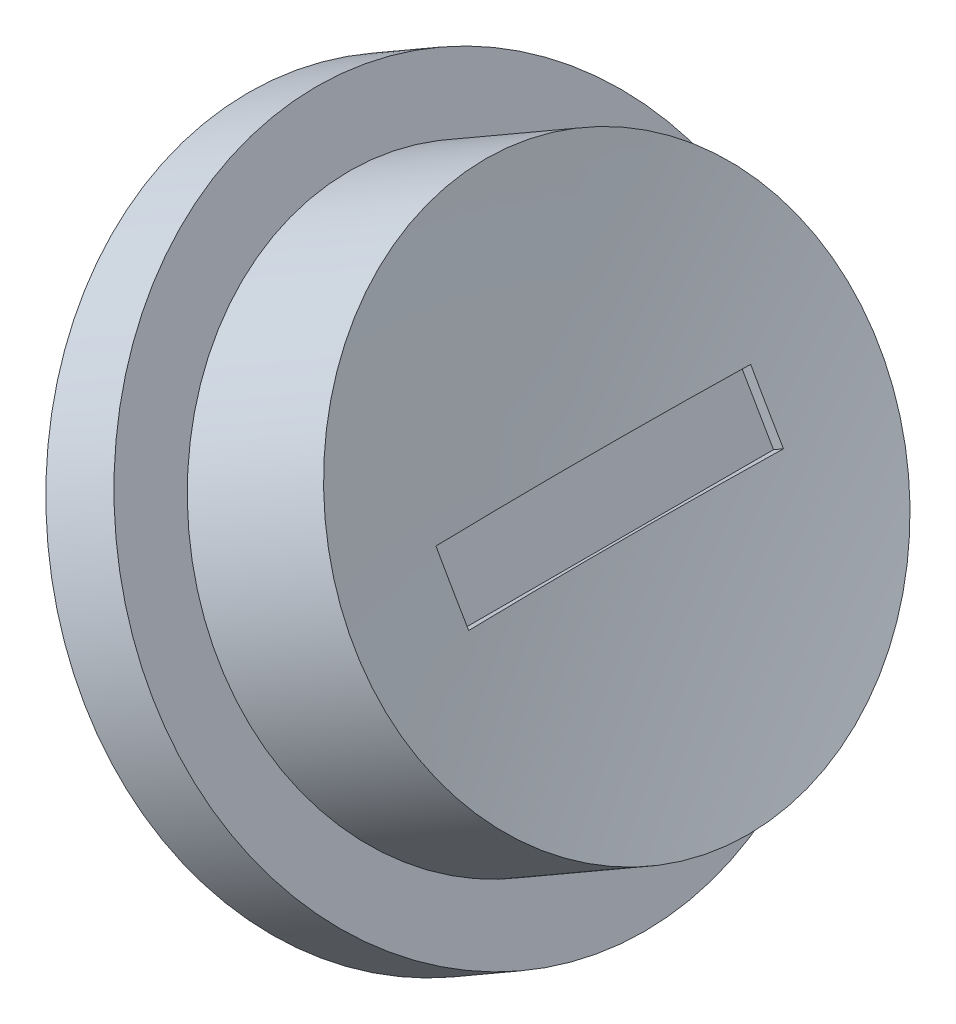
ISO-10303-21;
HEADER;
FILE_DESCRIPTION(('STEP AP214'),'2;1');
FILE_NAME('part.step','',(''),(''),'','','');
FILE_SCHEMA(('AUTOMOTIVE_DESIGN { 1 0 10303 214 1 1 1 1 }'));
ENDSEC;
DATA;
#1=APPLICATION_CONTEXT('core data for automotive mechanical design processes');
#2=APPLICATION_PROTOCOL_DEFINITION('international standard','automotive_design',2000,#1);
#3=PRODUCT_CONTEXT('',#1,'mechanical');
#4=PRODUCT('Part','Part','',(#3));
#5=PRODUCT_RELATED_PRODUCT_CATEGORY('part','',(#4));
#6=PRODUCT_DEFINITION_FORMATION('','',#4);
#7=PRODUCT_DEFINITION_CONTEXT('part definition',#1,'design');
#8=PRODUCT_DEFINITION('design','',#6,#7);
#9=PRODUCT_DEFINITION_SHAPE('','',#8);
#10=(LENGTH_UNIT() NAMED_UNIT(*) SI_UNIT(.MILLI.,.METRE.));
#11=(NAMED_UNIT(*) PLANE_ANGLE_UNIT() SI_UNIT($,.RADIAN.));
#12=(NAMED_UNIT(*) SI_UNIT($,.STERADIAN.) SOLID_ANGLE_UNIT());
#13=UNCERTAINTY_MEASURE_WITH_UNIT(LENGTH_MEASURE(1.E-05),#10,'distance_accuracy_value','');
#14=(GEOMETRIC_REPRESENTATION_CONTEXT(3) GLOBAL_UNCERTAINTY_ASSIGNED_CONTEXT((#13)) GLOBAL_UNIT_ASSIGNED_CONTEXT((#10,
#11,#12)) REPRESENTATION_CONTEXT('',''));
#15=CARTESIAN_POINT('',(0.,0.,0.));
#16=DIRECTION('',(0.,0.,1.));
#17=DIRECTION('',(1.,0.,0.));
#18=AXIS2_PLACEMENT_3D('',#15,#16,#17);
#19=CARTESIAN_POINT('',(60.5272413359522,-85.8362572358523,0.));
#20=DIRECTION('',(-0.866025403784438,-0.500000000000001,0.));
#21=DIRECTION('',(0.500000000000001,-0.866025403784438,0.));
#22=AXIS2_PLACEMENT_3D('',#19,#20,#21);
#23=PLANE('',#22);
#24=CARTESIAN_POINT('',(60.5272413359522,-85.8362572358523,0.));
#25=DIRECTION('',(0.866025403784438,0.500000000000001,0.));
#26=DIRECTION('',(-0.500000000000001,0.866025403784438,0.));
#27=AXIS2_PLACEMENT_3D('',#24,#25,#26);
#28=CIRCLE('',#27,2.);
#29=CARTESIAN_POINT('',(59.5272413359522,-84.1042064282834,0.));
#30=VERTEX_POINT('',#29);
#31=EDGE_CURVE('E123',#30,#30,#28,.T.);
#32=ORIENTED_EDGE('',*,*,#31,.F.);
#33=EDGE_LOOP('',(#32));
#34=FACE_BOUND('',#33,.T.);
#35=ADVANCED_FACE('F36',(#34),#23,.T.);
#36=CARTESIAN_POINT('',(65.7233937586588,-82.8362572358523,0.));
#37=DIRECTION('',(0.866025403784438,0.500000000000001,0.));
#38=DIRECTION('',(-0.500000000000001,0.866025403784438,0.));
#39=AXIS2_PLACEMENT_3D('',#36,#37,#38);
#40=CYLINDRICAL_SURFACE('',#39,2.);
#41=CARTESIAN_POINT('',(64.4243556529821,-83.5862572358523,0.));
#42=DIRECTION('',(0.866025403784438,0.500000000000001,0.));
#43=DIRECTION('',(-0.500000000000001,0.866025403784438,0.));
#44=AXIS2_PLACEMENT_3D('',#41,#42,#43);
#45=CIRCLE('',#44,1.99999999999999);
#46=CARTESIAN_POINT('',(63.4243556529821,-81.8542064282835,0.));
#47=VERTEX_POINT('',#46);
#48=EDGE_CURVE('E120',#47,#47,#45,.T.);
#49=CARTESIAN_POINT('',(59.5272413359522,-84.1042064282834,0.));
#50=CARTESIAN_POINT('',(59.5678362767546,-84.0807689282834,0.));
#51=CARTESIAN_POINT('',(59.608431217557,-84.0573314282834,0.));
#52=CARTESIAN_POINT('',(59.6896210991618,-84.0104564282834,0.));
#53=CARTESIAN_POINT('',(59.7302160399642,-83.9870189282834,0.));
#54=CARTESIAN_POINT('',(59.811405921569,-83.9401439282834,0.));
#55=CARTESIAN_POINT('',(59.8520008623714,-83.9167064282834,0.));
#56=CARTESIAN_POINT('',(59.9331907439762,-83.8698314282834,0.));
#57=CARTESIAN_POINT('',(59.9737856847786,-83.8463939282834,0.));
#58=CARTESIAN_POINT('',(60.0549755663833,-83.7995189282834,0.));
#59=CARTESIAN_POINT('',(60.0955705071857,-83.7760814282834,0.));
#60=CARTESIAN_POINT('',(60.1767603887905,-83.7292064282834,0.));
#61=CARTESIAN_POINT('',(60.2173553295929,-83.7057689282834,0.));
#62=CARTESIAN_POINT('',(60.2985452111977,-83.6588939282834,0.));
#63=CARTESIAN_POINT('',(60.3391401520001,-83.6354564282834,0.));
#64=CARTESIAN_POINT('',(60.4203300336049,-83.5885814282834,0.));
#65=CARTESIAN_POINT('',(60.4609249744073,-83.5651439282834,0.));
#66=CARTESIAN_POINT('',(60.5421148560121,-83.5182689282834,0.));
#67=CARTESIAN_POINT('',(60.5827097968145,-83.4948314282834,0.));
#68=CARTESIAN_POINT('',(60.6638996784193,-83.4479564282834,0.));
#69=CARTESIAN_POINT('',(60.7044946192217,-83.4245189282834,0.));
#70=CARTESIAN_POINT('',(60.7856845008265,-83.3776439282834,0.));
#71=CARTESIAN_POINT('',(60.8262794416288,-83.3542064282834,0.));
#72=CARTESIAN_POINT('',(60.9074693232336,-83.3073314282834,0.));
#73=CARTESIAN_POINT('',(60.948064264036,-83.2838939282834,0.));
#74=CARTESIAN_POINT('',(61.0292541456408,-83.2370189282834,0.));
#75=CARTESIAN_POINT('',(61.0698490864432,-83.2135814282834,0.));
#76=CARTESIAN_POINT('',(61.151038968048,-83.1667064282834,0.));
#77=CARTESIAN_POINT('',(61.1916339088504,-83.1432689282834,0.));
#78=CARTESIAN_POINT('',(61.2728237904552,-83.0963939282834,0.));
#79=CARTESIAN_POINT('',(61.3134187312576,-83.0729564282834,0.));
#80=CARTESIAN_POINT('',(61.3946086128624,-83.0260814282834,0.));
#81=CARTESIAN_POINT('',(61.4352035536648,-83.0026439282834,0.));
#82=CARTESIAN_POINT('',(61.5163934352696,-82.9557689282834,0.));
#83=CARTESIAN_POINT('',(61.556988376072,-82.9323314282834,0.));
#84=CARTESIAN_POINT('',(61.6381782576767,-82.8854564282834,0.));
#85=CARTESIAN_POINT('',(61.6787731984791,-82.8620189282834,0.));
#86=CARTESIAN_POINT('',(61.7599630800839,-82.8151439282834,0.));
#87=CARTESIAN_POINT('',(61.8005580208863,-82.7917064282834,0.));
#88=CARTESIAN_POINT('',(61.8817479024911,-82.7448314282834,0.));
#89=CARTESIAN_POINT('',(61.9223428432935,-82.7213939282834,0.));
#90=CARTESIAN_POINT('',(62.0035327248983,-82.6745189282834,0.));
#91=CARTESIAN_POINT('',(62.0441276657007,-82.6510814282834,0.));
#92=CARTESIAN_POINT('',(62.1253175473055,-82.6042064282834,0.));
#93=CARTESIAN_POINT('',(62.1659124881079,-82.5807689282834,0.));
#94=CARTESIAN_POINT('',(62.2471023697127,-82.5338939282834,0.));
#95=CARTESIAN_POINT('',(62.2876973105151,-82.5104564282834,0.));
#96=CARTESIAN_POINT('',(62.3688871921199,-82.4635814282834,0.));
#97=CARTESIAN_POINT('',(62.4094821329223,-82.4401439282835,0.));
#98=CARTESIAN_POINT('',(62.4906720145271,-82.3932689282835,0.));
#99=CARTESIAN_POINT('',(62.5312669553294,-82.3698314282835,0.));
#100=CARTESIAN_POINT('',(62.6124568369342,-82.3229564282834,0.));
#101=CARTESIAN_POINT('',(62.6530517777366,-82.2995189282834,0.));
#102=CARTESIAN_POINT('',(62.7342416593414,-82.2526439282834,0.));
#103=CARTESIAN_POINT('',(62.7748366001438,-82.2292064282834,0.));
#104=CARTESIAN_POINT('',(62.8560264817486,-82.1823314282834,0.));
#105=CARTESIAN_POINT('',(62.896621422551,-82.1588939282835,0.));
#106=CARTESIAN_POINT('',(62.9778113041558,-82.1120189282835,0.));
#107=CARTESIAN_POINT('',(63.0184062449582,-82.0885814282835,0.));
#108=CARTESIAN_POINT('',(63.099596126563,-82.0417064282835,0.));
#109=CARTESIAN_POINT('',(63.1401910673654,-82.0182689282835,0.));
#110=CARTESIAN_POINT('',(63.2213809489702,-81.9713939282834,0.));
#111=CARTESIAN_POINT('',(63.2619758897726,-81.9479564282834,0.));
#112=CARTESIAN_POINT('',(63.3431657713774,-81.9010814282834,0.));
#113=CARTESIAN_POINT('',(63.3837607121797,-81.8776439282835,0.));
#114=CARTESIAN_POINT('',(63.4243556529821,-81.8542064282835,0.));
#115=B_SPLINE_CURVE_WITH_KNOTS('',3,(#49,#50,#51,#52,#53,#54,#55,#56,#57,#58,#59,#60,#61,#62,
#63,#64,#65,#66,#67,#68,#69,#70,#71,#72,#73,#74,#75,#76,#77,#78,#79,#80,#81,#82,#83,#84,#85,#86,
#87,#88,#89,#90,#91,#92,#93,#94,#95,#96,#97,#98,#99,#100,#101,#102,#103,#104,#105,#106,#107,
#108,#109,#110,#111,#112,#113,#114),.UNSPECIFIED.,.F.,.F.,(4,2,2,2,2,2,2,2,2,2,2,2,2,2,2,2,2,2,
2,2,2,2,2,2,2,2,2,2,2,2,2,2,4),(0.,0.140624999999999,0.281249999999998,0.42187499999999,
0.562499999999988,0.703124999999993,0.843749999999992,0.984374999999984,1.12499999999998,
1.26562499999998,1.40624999999999,1.54687499999999,1.68749999999998,1.82812499999998,
1.96874999999998,2.10937499999998,2.24999999999997,2.39062499999997,2.53124999999997,
2.67187499999997,2.81249999999997,2.95312499999996,3.09374999999996,3.23437499999996,
3.37499999999996,3.51562499999996,3.65624999999996,3.79687499999996,3.93749999999995,
4.07812499999995,4.21874999999995,4.35937499999996,4.49999999999995),.UNSPECIFIED.);
#116=EDGE_CURVE('BSEAM153',#30,#47,#115,.T.);
#117=ORIENTED_EDGE('',*,*,#31,.T.);
#118=ORIENTED_EDGE('',*,*,#48,.F.);
#119=ORIENTED_EDGE('',*,*,#116,.T.);
#120=ORIENTED_EDGE('',*,*,#116,.F.);
#121=EDGE_LOOP('',(#117,#119,#118,#120));
#122=FACE_BOUND('',#121,.T.);
#123=ADVANCED_FACE('F153',(#122),#40,.T.);
#124=CARTESIAN_POINT('',(63.4243556529821,-81.8542064282835,0.));
#125=DIRECTION('',(-0.866025403784438,-0.500000000000001,0.));
#126=DIRECTION('',(0.500000000000001,-0.866025403784438,0.));
#127=AXIS2_PLACEMENT_3D('',#124,#125,#126);
#128=PLANE('',#127);
#129=ORIENTED_EDGE('',*,*,#48,.T.);
#130=EDGE_LOOP('',(#129));
#131=FACE_BOUND('',#130,.T.);
#132=CARTESIAN_POINT('',(64.4243556529821,-83.5862572358523,0.));
#133=DIRECTION('',(0.866025403784438,0.500000000000001,0.));
#134=DIRECTION('',(-0.500000000000001,0.866025403784438,0.));
#135=AXIS2_PLACEMENT_3D('',#132,#133,#134);
#136=CIRCLE('',#135,3.00000000000005);
#137=CARTESIAN_POINT('',(62.9243556529821,-80.988181024499,0.));
#138=VERTEX_POINT('',#137);
#139=EDGE_CURVE('E117',#138,#138,#136,.T.);
#140=ORIENTED_EDGE('',*,*,#139,.F.);
#141=EDGE_LOOP('',(#140));
#142=FACE_BOUND('',#141,.T.);
#143=ADVANCED_FACE('F158',(#131,#142),#128,.T.);
#144=CARTESIAN_POINT('',(65.7233937586588,-82.8362572358523,0.));
#145=DIRECTION('',(0.866025403784438,0.500000000000001,0.));
#146=DIRECTION('',(-0.500000000000001,0.866025403784438,0.));
#147=AXIS2_PLACEMENT_3D('',#144,#145,#146);
#148=CYLINDRICAL_SURFACE('',#147,3.00000000000006);
#149=CARTESIAN_POINT('',(62.6057023050348,-84.6362572358523,0.));
#150=DIRECTION('',(0.866025403784438,0.500000000000001,0.));
#151=DIRECTION('',(-0.500000000000001,0.866025403784438,0.));
#152=AXIS2_PLACEMENT_3D('',#149,#150,#151);
#153=CIRCLE('',#152,3.00000000000007);
#154=CARTESIAN_POINT('',(61.1057023050348,-82.038181024499,0.));
#155=VERTEX_POINT('',#154);
#156=EDGE_CURVE('E114',#155,#155,#153,.T.);
#157=CARTESIAN_POINT('',(62.9243556529821,-80.988181024499,0.));
#158=CARTESIAN_POINT('',(62.9054113472743,-80.999118524499,0.));
#159=CARTESIAN_POINT('',(62.8864670415665,-81.010056024499,0.));
#160=CARTESIAN_POINT('',(62.848578430151,-81.031931024499,0.));
#161=CARTESIAN_POINT('',(62.8296341244432,-81.042868524499,0.));
#162=CARTESIAN_POINT('',(62.7917455130276,-81.064743524499,0.));
#163=CARTESIAN_POINT('',(62.7728012073198,-81.0756810244989,0.));
#164=CARTESIAN_POINT('',(62.7349125959043,-81.097556024499,0.));
#165=CARTESIAN_POINT('',(62.7159682901965,-81.108493524499,0.));
#166=CARTESIAN_POINT('',(62.6780796787809,-81.130368524499,0.));
#167=CARTESIAN_POINT('',(62.6591353730731,-81.141306024499,0.));
#168=CARTESIAN_POINT('',(62.6212467616576,-81.163181024499,0.));
#169=CARTESIAN_POINT('',(62.6023024559498,-81.174118524499,0.));
#170=CARTESIAN_POINT('',(62.5644138445342,-81.195993524499,0.));
#171=CARTESIAN_POINT('',(62.5454695388264,-81.206931024499,0.));
#172=CARTESIAN_POINT('',(62.5075809274108,-81.228806024499,0.));
#173=CARTESIAN_POINT('',(62.4886366217031,-81.2397435244989,0.));
#174=CARTESIAN_POINT('',(62.4507480102875,-81.261618524499,0.));
#175=CARTESIAN_POINT('',(62.4318037045797,-81.272556024499,0.));
#176=CARTESIAN_POINT('',(62.3939150931641,-81.294431024499,0.));
#177=CARTESIAN_POINT('',(62.3749707874564,-81.305368524499,0.));
#178=CARTESIAN_POINT('',(62.3370821760408,-81.327243524499,0.));
#179=CARTESIAN_POINT('',(62.318137870333,-81.338181024499,0.));
#180=CARTESIAN_POINT('',(62.2802492589174,-81.360056024499,0.));
#181=CARTESIAN_POINT('',(62.2613049532097,-81.3709935244989,0.));
#182=CARTESIAN_POINT('',(62.2234163417941,-81.392868524499,0.));
#183=CARTESIAN_POINT('',(62.2044720360863,-81.4038060244989,0.));
#184=CARTESIAN_POINT('',(62.1665834246707,-81.425681024499,0.));
#185=CARTESIAN_POINT('',(62.1476391189629,-81.436618524499,0.));
#186=CARTESIAN_POINT('',(62.1097505075474,-81.458493524499,0.));
#187=CARTESIAN_POINT('',(62.0908062018396,-81.469431024499,0.));
#188=CARTESIAN_POINT('',(62.052917590424,-81.491306024499,0.));
#189=CARTESIAN_POINT('',(62.0339732847162,-81.502243524499,0.));
#190=CARTESIAN_POINT('',(61.9960846733007,-81.524118524499,0.));
#191=CARTESIAN_POINT('',(61.9771403675929,-81.535056024499,0.));
#192=CARTESIAN_POINT('',(61.9392517561773,-81.556931024499,0.));
#193=CARTESIAN_POINT('',(61.9203074504695,-81.567868524499,0.));
#194=CARTESIAN_POINT('',(61.882418839054,-81.589743524499,0.));
#195=CARTESIAN_POINT('',(61.8634745333462,-81.600681024499,0.));
#196=CARTESIAN_POINT('',(61.8255859219306,-81.622556024499,0.));
#197=CARTESIAN_POINT('',(61.8066416162228,-81.6334935244989,0.));
#198=CARTESIAN_POINT('',(61.7687530048073,-81.655368524499,0.));
#199=CARTESIAN_POINT('',(61.7498086990995,-81.666306024499,0.));
#200=CARTESIAN_POINT('',(61.7119200876839,-81.688181024499,0.));
#201=CARTESIAN_POINT('',(61.6929757819761,-81.699118524499,0.));
#202=CARTESIAN_POINT('',(61.6550871705605,-81.720993524499,0.));
#203=CARTESIAN_POINT('',(61.6361428648528,-81.7319310244989,0.));
#204=CARTESIAN_POINT('',(61.5982542534372,-81.753806024499,0.));
#205=CARTESIAN_POINT('',(61.5793099477294,-81.764743524499,0.));
#206=CARTESIAN_POINT('',(61.5414213363138,-81.786618524499,0.));
#207=CARTESIAN_POINT('',(61.5224770306061,-81.7975560244989,0.));
#208=CARTESIAN_POINT('',(61.4845884191905,-81.819431024499,0.));
#209=CARTESIAN_POINT('',(61.4656441134827,-81.830368524499,0.));
#210=CARTESIAN_POINT('',(61.4277555020671,-81.852243524499,0.));
#211=CARTESIAN_POINT('',(61.4088111963594,-81.863181024499,0.));
#212=CARTESIAN_POINT('',(61.3709225849438,-81.885056024499,0.));
#213=CARTESIAN_POINT('',(61.351978279236,-81.895993524499,0.));
#214=CARTESIAN_POINT('',(61.3140896678204,-81.917868524499,0.));
#215=CARTESIAN_POINT('',(61.2951453621126,-81.928806024499,0.));
#216=CARTESIAN_POINT('',(61.2572567506971,-81.950681024499,0.));
#217=CARTESIAN_POINT('',(61.2383124449893,-81.961618524499,0.));
#218=CARTESIAN_POINT('',(61.2004238335737,-81.983493524499,0.));
#219=CARTESIAN_POINT('',(61.1814795278659,-81.994431024499,0.));
#220=CARTESIAN_POINT('',(61.1435909164504,-82.016306024499,0.));
#221=CARTESIAN_POINT('',(61.1246466107426,-82.027243524499,0.));
#222=CARTESIAN_POINT('',(61.1057023050348,-82.038181024499,0.));
#223=B_SPLINE_CURVE_WITH_KNOTS('',3,(#157,#158,#159,#160,#161,#162,#163,#164,#165,#166,#167,
#168,#169,#170,#171,#172,#173,#174,#175,#176,#177,#178,#179,#180,#181,#182,#183,#184,#185,#186,
#187,#188,#189,#190,#191,#192,#193,#194,#195,#196,#197,#198,#199,#200,#201,#202,#203,#204,#205,
#206,#207,#208,#209,#210,#211,#212,#213,#214,#215,#216,#217,#218,#219,#220,#221,#222),
.UNSPECIFIED.,.F.,.F.,(4,2,2,2,2,2,2,2,2,2,2,2,2,2,2,2,2,2,2,2,2,2,2,2,2,2,2,2,2,2,2,2,4),(0.,
0.0656249999999985,0.131250000000004,0.196875000000002,0.262500000000008,0.328124999999994,
0.39375,0.459374999999998,0.524999999999991,0.590624999999996,0.656250000000002,
0.721874999999994,0.787499999999993,0.853124999999998,0.918749999999998,0.984374999999996,1.05,
1.11562499999999,1.18125,1.24687499999999,1.31249999999999,1.37812499999999,1.44374999999999,
1.50937499999999,1.57499999999999,1.64062499999999,1.70624999999999,1.77187499999999,
1.83749999999999,1.90312499999999,1.96874999999999,2.03437499999999,2.09999999999999),.UNSPECIFIED.);
#224=EDGE_CURVE('BSEAM165',#138,#155,#223,.T.);
#225=ORIENTED_EDGE('',*,*,#139,.T.);
#226=ORIENTED_EDGE('',*,*,#156,.F.);
#227=ORIENTED_EDGE('',*,*,#224,.T.);
#228=ORIENTED_EDGE('',*,*,#224,.F.);
#229=EDGE_LOOP('',(#225,#227,#226,#228));
#230=FACE_BOUND('',#229,.T.);
#231=ADVANCED_FACE('F165',(#230),#148,.F.);
#232=CARTESIAN_POINT('',(61.1057023050348,-82.0381810244989,0.));
#233=DIRECTION('',(-0.866025403784438,-0.500000000000001,0.));
#234=DIRECTION('',(0.500000000000001,-0.866025403784438,0.));
#235=AXIS2_PLACEMENT_3D('',#232,#233,#234);
#236=PLANE('',#235);
#237=ORIENTED_EDGE('',*,*,#156,.T.);
#238=EDGE_LOOP('',(#237));
#239=FACE_BOUND('',#238,.T.);
#240=CARTESIAN_POINT('',(62.6057023050348,-84.6362572358523,0.));
#241=DIRECTION('',(0.866025403784438,0.500000000000001,0.));
#242=DIRECTION('',(-0.500000000000001,0.866025403784438,0.));
#243=AXIS2_PLACEMENT_3D('',#240,#241,#242);
#244=CIRCLE('',#243,5.00000000000007);
#245=CARTESIAN_POINT('',(60.1057023050348,-80.3061302169301,0.));
#246=VERTEX_POINT('',#245);
#247=EDGE_CURVE('E111',#246,#246,#244,.T.);
#248=ORIENTED_EDGE('',*,*,#247,.F.);
#249=EDGE_LOOP('',(#248));
#250=FACE_BOUND('',#249,.T.);
#251=ADVANCED_FACE('F169',(#239,#250),#236,.T.);
#252=CARTESIAN_POINT('',(65.7233937586588,-82.8362572358523,0.));
#253=DIRECTION('',(0.866025403784438,0.500000000000001,0.));
#254=DIRECTION('',(-0.500000000000001,0.866025403784438,0.));
#255=AXIS2_PLACEMENT_3D('',#252,#253,#254);
#256=CYLINDRICAL_SURFACE('',#255,5.00000000000007);
#257=CARTESIAN_POINT('',(63.6449327895762,-84.0362572358523,0.));
#258=DIRECTION('',(0.866025403784438,0.500000000000001,0.));
#259=DIRECTION('',(-0.500000000000001,0.866025403784438,0.));
#260=AXIS2_PLACEMENT_3D('',#257,#258,#259);
#261=CIRCLE('',#260,5.00000000000007);
#262=CARTESIAN_POINT('',(61.1449327895761,-79.7061302169301,0.));
#263=VERTEX_POINT('',#262);
#264=EDGE_CURVE('E108',#263,#263,#261,.T.);
#265=CARTESIAN_POINT('',(60.1057023050348,-80.3061302169301,0.));
#266=CARTESIAN_POINT('',(60.1165276225821,-80.2998802169301,0.));
#267=CARTESIAN_POINT('',(60.1273529401294,-80.2936302169301,0.));
#268=CARTESIAN_POINT('',(60.149003575224,-80.2811302169301,0.));
#269=CARTESIAN_POINT('',(60.1598288927713,-80.2748802169301,0.));
#270=CARTESIAN_POINT('',(60.1814795278659,-80.2623802169301,0.));
#271=CARTESIAN_POINT('',(60.1923048454132,-80.2561302169301,0.));
#272=CARTESIAN_POINT('',(60.2139554805078,-80.2436302169301,0.));
#273=CARTESIAN_POINT('',(60.2247807980551,-80.2373802169301,0.));
#274=CARTESIAN_POINT('',(60.2464314331498,-80.2248802169301,0.));
#275=CARTESIAN_POINT('',(60.2572567506971,-80.2186302169301,0.));
#276=CARTESIAN_POINT('',(60.2789073857917,-80.2061302169301,0.));
#277=CARTESIAN_POINT('',(60.289732703339,-80.1998802169301,0.));
#278=CARTESIAN_POINT('',(60.3113833384336,-80.1873802169301,0.));
#279=CARTESIAN_POINT('',(60.3222086559809,-80.1811302169301,0.));
#280=CARTESIAN_POINT('',(60.3438592910755,-80.1686302169301,0.));
#281=CARTESIAN_POINT('',(60.3546846086228,-80.1623802169301,0.));
#282=CARTESIAN_POINT('',(60.3763352437174,-80.1498802169301,0.));
#283=CARTESIAN_POINT('',(60.3871605612647,-80.1436302169301,0.));
#284=CARTESIAN_POINT('',(60.4088111963593,-80.1311302169301,0.));
#285=CARTESIAN_POINT('',(60.4196365139066,-80.1248802169301,0.));
#286=CARTESIAN_POINT('',(60.4412871490013,-80.1123802169301,0.));
#287=CARTESIAN_POINT('',(60.4521124665486,-80.1061302169301,0.));
#288=CARTESIAN_POINT('',(60.4737631016432,-80.0936302169301,0.));
#289=CARTESIAN_POINT('',(60.4845884191905,-80.0873802169301,0.));
#290=CARTESIAN_POINT('',(60.5062390542851,-80.0748802169301,0.));
#291=CARTESIAN_POINT('',(60.5170643718324,-80.0686302169301,0.));
#292=CARTESIAN_POINT('',(60.538715006927,-80.0561302169301,0.));
#293=CARTESIAN_POINT('',(60.5495403244743,-80.0498802169301,0.));
#294=CARTESIAN_POINT('',(60.5711909595689,-80.0373802169301,0.));
#295=CARTESIAN_POINT('',(60.5820162771162,-80.0311302169301,0.));
#296=CARTESIAN_POINT('',(60.6036669122108,-80.0186302169301,0.));
#297=CARTESIAN_POINT('',(60.6144922297581,-80.0123802169301,0.));
#298=CARTESIAN_POINT('',(60.6361428648528,-79.9998802169301,0.));
#299=CARTESIAN_POINT('',(60.6469681824001,-79.9936302169301,0.));
#300=CARTESIAN_POINT('',(60.6686188174947,-79.9811302169301,0.));
#301=CARTESIAN_POINT('',(60.679444135042,-79.9748802169301,0.));
#302=CARTESIAN_POINT('',(60.7010947701366,-79.9623802169301,0.));
#303=CARTESIAN_POINT('',(60.7119200876839,-79.9561302169301,0.));
#304=CARTESIAN_POINT('',(60.7335707227785,-79.9436302169301,0.));
#305=CARTESIAN_POINT('',(60.7443960403258,-79.9373802169301,0.));
#306=CARTESIAN_POINT('',(60.7660466754204,-79.9248802169301,0.));
#307=CARTESIAN_POINT('',(60.7768719929677,-79.9186302169301,0.));
#308=CARTESIAN_POINT('',(60.7985226280623,-79.9061302169301,0.));
#309=CARTESIAN_POINT('',(60.8093479456096,-79.8998802169301,0.));
#310=CARTESIAN_POINT('',(60.8309985807043,-79.8873802169301,0.));
#311=CARTESIAN_POINT('',(60.8418238982516,-79.8811302169301,0.));
#312=CARTESIAN_POINT('',(60.8634745333462,-79.8686302169301,0.));
#313=CARTESIAN_POINT('',(60.8742998508935,-79.8623802169301,0.));
#314=CARTESIAN_POINT('',(60.8959504859881,-79.8498802169301,0.));
#315=CARTESIAN_POINT('',(60.9067758035354,-79.8436302169301,0.));
#316=CARTESIAN_POINT('',(60.92842643863,-79.8311302169301,0.));
#317=CARTESIAN_POINT('',(60.9392517561773,-79.8248802169301,0.));
#318=CARTESIAN_POINT('',(60.9609023912719,-79.8123802169301,0.));
#319=CARTESIAN_POINT('',(60.9717277088192,-79.8061302169301,0.));
#320=CARTESIAN_POINT('',(60.9933783439138,-79.7936302169301,0.));
#321=CARTESIAN_POINT('',(61.0042036614611,-79.7873802169301,0.));
#322=CARTESIAN_POINT('',(61.0258542965558,-79.7748802169301,0.));
#323=CARTESIAN_POINT('',(61.0366796141031,-79.7686302169301,0.));
#324=CARTESIAN_POINT('',(61.0583302491977,-79.7561302169301,0.));
#325=CARTESIAN_POINT('',(61.069155566745,-79.7498802169301,0.));
#326=CARTESIAN_POINT('',(61.0908062018396,-79.7373802169301,0.));
#327=CARTESIAN_POINT('',(61.1016315193869,-79.7311302169301,0.));
#328=CARTESIAN_POINT('',(61.1232821544815,-79.7186302169301,0.));
#329=CARTESIAN_POINT('',(61.1341074720288,-79.7123802169301,0.));
#330=CARTESIAN_POINT('',(61.1449327895761,-79.7061302169301,0.));
#331=B_SPLINE_CURVE_WITH_KNOTS('',3,(#265,#266,#267,#268,#269,#270,#271,#272,#273,#274,#275,
#276,#277,#278,#279,#280,#281,#282,#283,#284,#285,#286,#287,#288,#289,#290,#291,#292,#293,#294,
#295,#296,#297,#298,#299,#300,#301,#302,#303,#304,#305,#306,#307,#308,#309,#310,#311,#312,#313,
#314,#315,#316,#317,#318,#319,#320,#321,#322,#323,#324,#325,#326,#327,#328,#329,#330),
.UNSPECIFIED.,.F.,.F.,(4,2,2,2,2,2,2,2,2,2,2,2,2,2,2,2,2,2,2,2,2,2,2,2,2,2,2,2,2,2,2,2,4),(0.,
0.0374999999999967,0.0749999999999934,0.112499999999996,0.149999999999993,0.187499999999989,
0.224999999999999,0.262499999999996,0.299999999999998,0.337499999999995,0.374999999999992,
0.412499999999995,0.449999999999991,0.487499999999995,0.524999999999998,0.562499999999994,
0.599999999999997,0.637499999999994,0.67499999999999,0.7125,0.749999999999997,0.787499999999994,
0.824999999999996,0.862499999999993,0.899999999999996,0.937499999999992,0.974999999999996,
1.0125,1.05,1.08749999999999,1.125,1.16249999999999,1.19999999999999),.UNSPECIFIED.);
#332=EDGE_CURVE('BSEAM148',#246,#263,#331,.T.);
#333=ORIENTED_EDGE('',*,*,#247,.T.);
#334=ORIENTED_EDGE('',*,*,#264,.F.);
#335=ORIENTED_EDGE('',*,*,#332,.T.);
#336=ORIENTED_EDGE('',*,*,#332,.F.);
#337=EDGE_LOOP('',(#333,#335,#334,#336));
#338=FACE_BOUND('',#337,.T.);
#339=ADVANCED_FACE('F148',(#338),#256,.T.);
#340=CARTESIAN_POINT('',(61.1449327895761,-79.7061302169301,0.));
#341=DIRECTION('',(0.866025403784438,0.500000000000001,0.));
#342=DIRECTION('',(-0.500000000000001,0.866025403784438,0.));
#343=AXIS2_PLACEMENT_3D('',#340,#341,#342);
#344=PLANE('',#343);
#345=ORIENTED_EDGE('',*,*,#264,.T.);
#346=EDGE_LOOP('',(#345));
#347=FACE_BOUND('',#346,.T.);
#348=CARTESIAN_POINT('',(63.6449327895762,-84.0362572358523,0.));
#349=DIRECTION('',(0.866025403784438,0.500000000000001,0.));
#350=DIRECTION('',(-0.500000000000001,0.866025403784438,0.));
#351=AXIS2_PLACEMENT_3D('',#348,#349,#350);
#352=CIRCLE('',#351,4.00000000000006);
#353=CARTESIAN_POINT('',(61.6449327895761,-80.5721556207145,0.));
#354=VERTEX_POINT('',#353);
#355=EDGE_CURVE('E105',#354,#354,#352,.T.);
#356=ORIENTED_EDGE('',*,*,#355,.F.);
#357=EDGE_LOOP('',(#356));
#358=FACE_BOUND('',#357,.T.);
#359=ADVANCED_FACE('F142',(#347,#358),#344,.T.);
#360=CARTESIAN_POINT('',(65.7233937586588,-82.8362572358523,0.));
#361=DIRECTION('',(0.866025403784438,0.500000000000001,0.));
#362=DIRECTION('',(-0.500000000000001,0.866025403784438,0.));
#363=AXIS2_PLACEMENT_3D('',#360,#361,#362);
#364=CYLINDRICAL_SURFACE('',#363,4.00000000000004);
#365=CARTESIAN_POINT('',(65.7233937586588,-82.8362572358523,0.));
#366=DIRECTION('',(0.866025403784438,0.500000000000001,0.));
#367=DIRECTION('',(-0.500000000000001,0.866025403784438,0.));
#368=AXIS2_PLACEMENT_3D('',#365,#366,#367);
#369=CIRCLE('',#368,4.00000000000002);
#370=CARTESIAN_POINT('',(63.7233937586588,-79.3721556207145,0.));
#371=VERTEX_POINT('',#370);
#372=EDGE_CURVE('E101',#371,#371,#369,.T.);
#373=CARTESIAN_POINT('',(61.6449327895761,-80.5721556207145,0.));
#374=CARTESIAN_POINT('',(61.6665834246707,-80.5596556207145,0.));
#375=CARTESIAN_POINT('',(61.6882340597654,-80.5471556207145,0.));
#376=CARTESIAN_POINT('',(61.7315353299546,-80.5221556207145,0.));
#377=CARTESIAN_POINT('',(61.7531859650492,-80.5096556207145,0.));
#378=CARTESIAN_POINT('',(61.7964872352384,-80.4846556207145,0.));
#379=CARTESIAN_POINT('',(61.818137870333,-80.4721556207145,0.));
#380=CARTESIAN_POINT('',(61.8614391405223,-80.4471556207145,0.));
#381=CARTESIAN_POINT('',(61.8830897756169,-80.4346556207145,0.));
#382=CARTESIAN_POINT('',(61.9263910458061,-80.4096556207145,0.));
#383=CARTESIAN_POINT('',(61.9480416809007,-80.3971556207145,0.));
#384=CARTESIAN_POINT('',(61.9913429510899,-80.3721556207145,0.));
#385=CARTESIAN_POINT('',(62.0129935861845,-80.3596556207145,0.));
#386=CARTESIAN_POINT('',(62.0562948563737,-80.3346556207145,0.));
#387=CARTESIAN_POINT('',(62.0779454914684,-80.3221556207145,0.));
#388=CARTESIAN_POINT('',(62.1212467616576,-80.2971556207145,0.));
#389=CARTESIAN_POINT('',(62.1428973967522,-80.2846556207145,0.));
#390=CARTESIAN_POINT('',(62.1861986669414,-80.2596556207145,0.));
#391=CARTESIAN_POINT('',(62.207849302036,-80.2471556207145,0.));
#392=CARTESIAN_POINT('',(62.2511505722252,-80.2221556207145,0.));
#393=CARTESIAN_POINT('',(62.2728012073199,-80.2096556207145,0.));
#394=CARTESIAN_POINT('',(62.3161024775091,-80.1846556207145,0.));
#395=CARTESIAN_POINT('',(62.3377531126037,-80.1721556207145,0.));
#396=CARTESIAN_POINT('',(62.3810543827929,-80.1471556207145,0.));
#397=CARTESIAN_POINT('',(62.4027050178875,-80.1346556207145,0.));
#398=CARTESIAN_POINT('',(62.4460062880767,-80.1096556207145,0.));
#399=CARTESIAN_POINT('',(62.4676569231714,-80.0971556207145,0.));
#400=CARTESIAN_POINT('',(62.5109581933606,-80.0721556207145,0.));
#401=CARTESIAN_POINT('',(62.5326088284552,-80.0596556207145,0.));
#402=CARTESIAN_POINT('',(62.5759100986444,-80.0346556207145,0.));
#403=CARTESIAN_POINT('',(62.597560733739,-80.0221556207145,0.));
#404=CARTESIAN_POINT('',(62.6408620039283,-79.9971556207145,0.));
#405=CARTESIAN_POINT('',(62.6625126390229,-79.9846556207145,0.));
#406=CARTESIAN_POINT('',(62.7058139092121,-79.9596556207145,0.));
#407=CARTESIAN_POINT('',(62.7274645443067,-79.9471556207145,0.));
#408=CARTESIAN_POINT('',(62.7707658144959,-79.9221556207145,0.));
#409=CARTESIAN_POINT('',(62.7924164495905,-79.9096556207145,0.));
#410=CARTESIAN_POINT('',(62.8357177197798,-79.8846556207145,0.));
#411=CARTESIAN_POINT('',(62.8573683548743,-79.8721556207145,0.));
#412=CARTESIAN_POINT('',(62.9006696250636,-79.8471556207145,0.));
#413=CARTESIAN_POINT('',(62.9223202601582,-79.8346556207145,0.));
#414=CARTESIAN_POINT('',(62.9656215303474,-79.8096556207145,0.));
#415=CARTESIAN_POINT('',(62.987272165442,-79.7971556207145,0.));
#416=CARTESIAN_POINT('',(63.0305734356312,-79.7721556207145,0.));
#417=CARTESIAN_POINT('',(63.0522240707258,-79.7596556207145,0.));
#418=CARTESIAN_POINT('',(63.0955253409151,-79.7346556207145,0.));
#419=CARTESIAN_POINT('',(63.1171759760097,-79.7221556207145,0.));
#420=CARTESIAN_POINT('',(63.1604772461989,-79.6971556207145,0.));
#421=CARTESIAN_POINT('',(63.1821278812935,-79.6846556207145,0.));
#422=CARTESIAN_POINT('',(63.2254291514827,-79.6596556207145,0.));
#423=CARTESIAN_POINT('',(63.2470797865773,-79.6471556207145,0.));
#424=CARTESIAN_POINT('',(63.2903810567666,-79.6221556207145,0.));
#425=CARTESIAN_POINT('',(63.3120316918612,-79.6096556207145,0.));
#426=CARTESIAN_POINT('',(63.3553329620504,-79.5846556207145,0.));
#427=CARTESIAN_POINT('',(63.376983597145,-79.5721556207145,0.));
#428=CARTESIAN_POINT('',(63.4202848673342,-79.5471556207145,0.));
#429=CARTESIAN_POINT('',(63.4419355024288,-79.5346556207145,0.));
#430=CARTESIAN_POINT('',(63.4852367726181,-79.5096556207145,0.));
#431=CARTESIAN_POINT('',(63.5068874077127,-79.4971556207145,0.));
#432=CARTESIAN_POINT('',(63.5501886779019,-79.4721556207145,0.));
#433=CARTESIAN_POINT('',(63.5718393129965,-79.4596556207145,0.));
#434=CARTESIAN_POINT('',(63.6151405831857,-79.4346556207145,0.));
#435=CARTESIAN_POINT('',(63.6367912182803,-79.4221556207145,0.));
#436=CARTESIAN_POINT('',(63.6800924884696,-79.3971556207145,0.));
#437=CARTESIAN_POINT('',(63.7017431235642,-79.3846556207145,0.));
#438=CARTESIAN_POINT('',(63.7233937586588,-79.3721556207145,0.));
#439=B_SPLINE_CURVE_WITH_KNOTS('',3,(#373,#374,#375,#376,#377,#378,#379,#380,#381,#382,#383,
#384,#385,#386,#387,#388,#389,#390,#391,#392,#393,#394,#395,#396,#397,#398,#399,#400,#401,#402,
#403,#404,#405,#406,#407,#408,#409,#410,#411,#412,#413,#414,#415,#416,#417,#418,#419,#420,#421,
#422,#423,#424,#425,#426,#427,#428,#429,#430,#431,#432,#433,#434,#435,#436,#437,#438),
.UNSPECIFIED.,.F.,.F.,(4,2,2,2,2,2,2,2,2,2,2,2,2,2,2,2,2,2,2,2,2,2,2,2,2,2,2,2,2,2,2,2,4),(0.,
0.0750000000000064,0.150000000000006,0.225000000000005,0.300000000000005,0.375000000000005,
0.450000000000004,0.525000000000005,0.600000000000004,0.675000000000003,0.750000000000003,
0.825000000000003,0.900000000000003,0.975000000000002,1.05,1.12500000000001,1.2,
1.27499999999999,1.35000000000001,1.425,1.49999999999999,1.57500000000001,1.65,1.72499999999999,
1.8,1.875,1.94999999999999,2.025,2.1,2.17499999999999,2.25,2.32499999999999,2.4),.UNSPECIFIED.);
#440=EDGE_CURVE('BSEAM138',#354,#371,#439,.T.);
#441=ORIENTED_EDGE('',*,*,#355,.T.);
#442=ORIENTED_EDGE('',*,*,#372,.F.);
#443=ORIENTED_EDGE('',*,*,#440,.T.);
#444=ORIENTED_EDGE('',*,*,#440,.F.);
#445=EDGE_LOOP('',(#441,#443,#442,#444));
#446=FACE_BOUND('',#445,.T.);
#447=ADVANCED_FACE('F138',(#446),#364,.T.);
#448=CARTESIAN_POINT('',(100.277807369658,-62.886257235851,0.));
#449=DIRECTION('',(0.,0.,1.));
#450=DIRECTION('',(1.,0.,0.));
#451=AXIS2_PLACEMENT_3D('',#448,#449,#450);
#452=SPHERICAL_SURFACE('',#451,40.100000000001);
#453=CARTESIAN_POINT('',(100.277807369658,-62.886257235851,2.4));
#454=DIRECTION('',(0.,0.,1.));
#455=DIRECTION('',(1.,0.,0.));
#456=AXIS2_PLACEMENT_3D('',#453,#454,#455);
#457=CIRCLE('',#456,40.0281151192519);
#458=CARTESIAN_POINT('',(65.3651473447839,-82.4657406301496,2.4));
#459=VERTEX_POINT('',#458);
#460=CARTESIAN_POINT('',(65.8651473447839,-83.331766033934,2.4));
#461=VERTEX_POINT('',#460);
#462=EDGE_CURVE('E11',#459,#461,#457,.T.);
#463=ORIENTED_EDGE('',*,*,#462,.F.);
#464=CARTESIAN_POINT('',(100.027807369659,-62.4532445339596,0.));
#465=DIRECTION('',(-0.5,0.866025403784439,0.));
#466=DIRECTION('',(-0.866025403784439,-0.5,0.));
#467=AXIS2_PLACEMENT_3D('',#464,#465,#466);
#468=CIRCLE('',#467,40.0968826718497);
#469=CARTESIAN_POINT('',(65.3651473447838,-82.4657406301496,-2.4));
#470=VERTEX_POINT('',#469);
#471=EDGE_CURVE('E44',#470,#459,#468,.T.);
#472=ORIENTED_EDGE('',*,*,#471,.F.);
#473=CARTESIAN_POINT('',(100.277807369658,-62.886257235851,-2.4));
#474=DIRECTION('',(0.,0.,-1.));
#475=DIRECTION('',(-1.,0.,0.));
#476=AXIS2_PLACEMENT_3D('',#473,#474,#475);
#477=CIRCLE('',#476,40.0281151192519);
#478=CARTESIAN_POINT('',(65.8651473447839,-83.331766033934,-2.4));
#479=VERTEX_POINT('',#478);
#480=EDGE_CURVE('E130',#479,#470,#477,.T.);
#481=ORIENTED_EDGE('',*,*,#480,.F.);
#482=CARTESIAN_POINT('',(100.527807369659,-63.3192699377441,0.));
#483=DIRECTION('',(0.5,-0.866025403784439,0.));
#484=DIRECTION('',(0.866025403784439,0.5,0.));
#485=AXIS2_PLACEMENT_3D('',#482,#483,#484);
#486=CIRCLE('',#485,40.0968826718497);
#487=EDGE_CURVE('E126',#461,#479,#486,.T.);
#488=ORIENTED_EDGE('',*,*,#487,.F.);
#489=EDGE_LOOP('',(#463,#472,#481,#488));
#490=FACE_BOUND('',#489,.T.);
#491=ORIENTED_EDGE('',*,*,#372,.T.);
#492=EDGE_LOOP('',(#491));
#493=FACE_BOUND('',#492,.T.);
#494=ADVANCED_FACE('F38',(#490,#493),#452,.F.);
#495=CARTESIAN_POINT('',(65.2135861375234,-82.5532445339601,2.4));
#496=DIRECTION('',(0.,0.,1.));
#497=DIRECTION('',(1.,0.,0.));
#498=AXIS2_PLACEMENT_3D('',#495,#496,#497);
#499=PLANE('',#498);
#500=ORIENTED_EDGE('',*,*,#462,.T.);
#501=DIRECTION('',(0.866025403784439,0.5,0.));
#502=VECTOR('',#501,1.);
#503=CARTESIAN_POINT('',(65.7135861375234,-83.4192699377446,2.4));
#504=LINE('',#503,#502);
#505=CARTESIAN_POINT('',(65.7135861375234,-83.4192699377446,2.4));
#506=VERTEX_POINT('',#505);
#507=EDGE_CURVE('E51',#506,#461,#504,.T.);
#508=ORIENTED_EDGE('',*,*,#507,.F.);
#509=DIRECTION('',(0.499999999999998,-0.866025403784439,0.));
#510=VECTOR('',#509,1.);
#511=CARTESIAN_POINT('',(65.2135861375234,-82.5532445339601,2.4));
#512=LINE('',#511,#510);
#513=CARTESIAN_POINT('',(65.2135861375234,-82.5532445339601,2.4));
#514=VERTEX_POINT('',#513);
#515=EDGE_CURVE('E77',#514,#506,#512,.T.);
#516=ORIENTED_EDGE('',*,*,#515,.F.);
#517=DIRECTION('',(0.866025403784439,0.5,0.));
#518=VECTOR('',#517,1.);
#519=CARTESIAN_POINT('',(65.2135861375234,-82.5532445339601,2.4));
#520=LINE('',#519,#518);
#521=EDGE_CURVE('E99',#514,#459,#520,.T.);
#522=ORIENTED_EDGE('',*,*,#521,.T.);
#523=EDGE_LOOP('',(#500,#508,#516,#522));
#524=FACE_BOUND('',#523,.T.);
#525=ADVANCED_FACE('F75',(#524),#499,.F.);
#526=CARTESIAN_POINT('',(65.2135861375234,-82.5532445339601,2.4));
#527=DIRECTION('',(-0.5,0.866025403784439,0.));
#528=DIRECTION('',(-0.866025403784439,-0.5,0.));
#529=AXIS2_PLACEMENT_3D('',#526,#527,#528);
#530=PLANE('',#529);
#531=ORIENTED_EDGE('',*,*,#471,.T.);
#532=ORIENTED_EDGE('',*,*,#521,.F.);
#533=DIRECTION('',(0.,0.,1.));
#534=VECTOR('',#533,1.);
#535=CARTESIAN_POINT('',(65.2135861375234,-82.5532445339601,2.4));
#536=LINE('',#535,#534);
#537=CARTESIAN_POINT('',(65.2135861375234,-82.5532445339601,-2.4));
#538=VERTEX_POINT('',#537);
#539=EDGE_CURVE('E82',#538,#514,#536,.T.);
#540=ORIENTED_EDGE('',*,*,#539,.F.);
#541=DIRECTION('',(0.866025403784439,0.5,0.));
#542=VECTOR('',#541,1.);
#543=CARTESIAN_POINT('',(65.2135861375234,-82.5532445339601,-2.4));
#544=LINE('',#543,#542);
#545=EDGE_CURVE('E102',#538,#470,#544,.T.);
#546=ORIENTED_EDGE('',*,*,#545,.T.);
#547=EDGE_LOOP('',(#531,#532,#540,#546));
#548=FACE_BOUND('',#547,.T.);
#549=ADVANCED_FACE('F135',(#548),#530,.F.);
#550=CARTESIAN_POINT('',(65.2135861375234,-82.5532445339601,-2.4));
#551=DIRECTION('',(0.,0.,-1.));
#552=DIRECTION('',(-1.,0.,0.));
#553=AXIS2_PLACEMENT_3D('',#550,#551,#552);
#554=PLANE('',#553);
#555=ORIENTED_EDGE('',*,*,#480,.T.);
#556=ORIENTED_EDGE('',*,*,#545,.F.);
#557=DIRECTION('',(-0.499999999999998,0.866025403784439,0.));
#558=VECTOR('',#557,1.);
#559=CARTESIAN_POINT('',(65.2135861375234,-82.5532445339601,-2.4));
#560=LINE('',#559,#558);
#561=CARTESIAN_POINT('',(65.7135861375234,-83.4192699377446,-2.4));
#562=VERTEX_POINT('',#561);
#563=EDGE_CURVE('E91',#562,#538,#560,.T.);
#564=ORIENTED_EDGE('',*,*,#563,.F.);
#565=DIRECTION('',(0.866025403784439,0.5,0.));
#566=VECTOR('',#565,1.);
#567=CARTESIAN_POINT('',(65.7135861375234,-83.4192699377446,-2.4));
#568=LINE('',#567,#566);
#569=EDGE_CURVE('E81',#562,#479,#568,.T.);
#570=ORIENTED_EDGE('',*,*,#569,.T.);
#571=EDGE_LOOP('',(#555,#556,#564,#570));
#572=FACE_BOUND('',#571,.T.);
#573=ADVANCED_FACE('F133',(#572),#554,.F.);
#574=CARTESIAN_POINT('',(65.7135861375234,-83.4192699377446,2.4));
#575=DIRECTION('',(0.5,-0.866025403784439,0.));
#576=DIRECTION('',(0.866025403784439,0.5,0.));
#577=AXIS2_PLACEMENT_3D('',#574,#575,#576);
#578=PLANE('',#577);
#579=ORIENTED_EDGE('',*,*,#487,.T.);
#580=ORIENTED_EDGE('',*,*,#569,.F.);
#581=DIRECTION('',(0.,0.,-1.));
#582=VECTOR('',#581,1.);
#583=CARTESIAN_POINT('',(65.7135861375234,-83.4192699377446,2.4));
#584=LINE('',#583,#582);
#585=EDGE_CURVE('E85',#506,#562,#584,.T.);
#586=ORIENTED_EDGE('',*,*,#585,.F.);
#587=ORIENTED_EDGE('',*,*,#507,.T.);
#588=EDGE_LOOP('',(#579,#580,#586,#587));
#589=FACE_BOUND('',#588,.T.);
#590=ADVANCED_FACE('F86',(#589),#578,.F.);
#591=CARTESIAN_POINT('',(13.1635861375236,7.60000000000004,0.));
#592=DIRECTION('',(0.86602540378444,0.499999999999999,0.));
#593=DIRECTION('',(-0.499999999999999,0.86602540378444,0.));
#594=AXIS2_PLACEMENT_3D('',#591,#592,#593);
#595=PLANE('',#594);
#596=ORIENTED_EDGE('',*,*,#515,.T.);
#597=ORIENTED_EDGE('',*,*,#585,.T.);
#598=ORIENTED_EDGE('',*,*,#563,.T.);
#599=ORIENTED_EDGE('',*,*,#539,.T.);
#600=EDGE_LOOP('',(#596,#597,#598,#599));
#601=FACE_BOUND('',#600,.T.);
#602=ADVANCED_FACE('F93',(#601),#595,.T.);
#603=CLOSED_SHELL('',(#35,#123,#143,#231,#251,#339,#359,#447,#494,#525,#549,#573,#590,#602));
#604=MANIFOLD_SOLID_BREP('B2',#603);
#605=ADVANCED_BREP_SHAPE_REPRESENTATION('',(#18,#604),#14);
#606=SHAPE_DEFINITION_REPRESENTATION(#9,#605);
ENDSEC;
END-ISO-10303-21;
